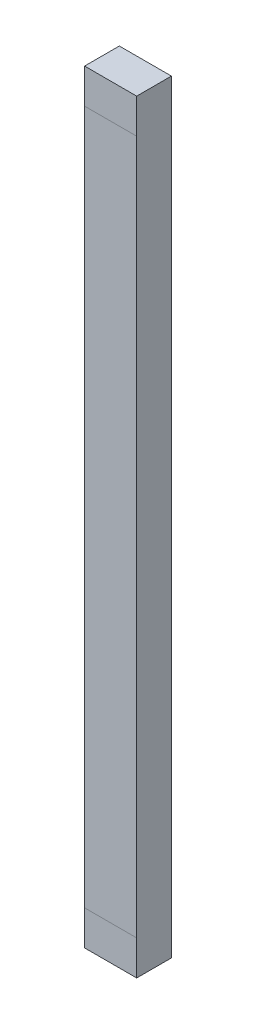
ISO-10303-21;
HEADER;
FILE_DESCRIPTION(('STEP AP214'),'2;1');
FILE_NAME('part.step','',(''),(''),'','','');
FILE_SCHEMA(('AUTOMOTIVE_DESIGN { 1 0 10303 214 1 1 1 1 }'));
ENDSEC;
DATA;
#1=APPLICATION_CONTEXT('core data for automotive mechanical design processes');
#2=APPLICATION_PROTOCOL_DEFINITION('international standard','automotive_design',2000,#1);
#3=PRODUCT_CONTEXT('',#1,'mechanical');
#4=PRODUCT('Part','Part','',(#3));
#5=PRODUCT_RELATED_PRODUCT_CATEGORY('part','',(#4));
#6=PRODUCT_DEFINITION_FORMATION('','',#4);
#7=PRODUCT_DEFINITION_CONTEXT('part definition',#1,'design');
#8=PRODUCT_DEFINITION('design','',#6,#7);
#9=PRODUCT_DEFINITION_SHAPE('','',#8);
#10=(LENGTH_UNIT() NAMED_UNIT(*) SI_UNIT(.MILLI.,.METRE.));
#11=(NAMED_UNIT(*) PLANE_ANGLE_UNIT() SI_UNIT($,.RADIAN.));
#12=(NAMED_UNIT(*) SI_UNIT($,.STERADIAN.) SOLID_ANGLE_UNIT());
#13=UNCERTAINTY_MEASURE_WITH_UNIT(LENGTH_MEASURE(1.E-05),#10,'distance_accuracy_value','');
#14=(GEOMETRIC_REPRESENTATION_CONTEXT(3) GLOBAL_UNCERTAINTY_ASSIGNED_CONTEXT((#13)) GLOBAL_UNIT_ASSIGNED_CONTEXT((#10,
#11,#12)) REPRESENTATION_CONTEXT('',''));
#15=CARTESIAN_POINT('',(0.,0.,0.));
#16=DIRECTION('',(0.,0.,1.));
#17=DIRECTION('',(1.,0.,0.));
#18=AXIS2_PLACEMENT_3D('',#15,#16,#17);
#19=CARTESIAN_POINT('',(0.,2200.,0.));
#20=DIRECTION('',(0.,0.,-1.));
#21=DIRECTION('',(-1.,0.,0.));
#22=AXIS2_PLACEMENT_3D('',#19,#20,#21);
#23=PLANE('',#22);
#24=DIRECTION('',(1.,0.,0.));
#25=VECTOR('',#24,1.);
#26=CARTESIAN_POINT('',(0.,100.,0.));
#27=LINE('',#26,#25);
#28=CARTESIAN_POINT('',(0.,100.,0.));
#29=VERTEX_POINT('',#28);
#30=CARTESIAN_POINT('',(150.,100.,0.));
#31=VERTEX_POINT('',#30);
#32=EDGE_CURVE('E12',#29,#31,#27,.T.);
#33=ORIENTED_EDGE('',*,*,#32,.F.);
#34=DIRECTION('',(0.,-1.,0.));
#35=VECTOR('',#34,1.);
#36=CARTESIAN_POINT('',(0.,2200.,0.));
#37=LINE('',#36,#35);
#38=CARTESIAN_POINT('',(0.,0.,0.));
#39=VERTEX_POINT('',#38);
#40=EDGE_CURVE('E136',#29,#39,#37,.T.);
#41=ORIENTED_EDGE('',*,*,#40,.T.);
#42=DIRECTION('',(1.,0.,0.));
#43=VECTOR('',#42,1.);
#44=CARTESIAN_POINT('',(0.,0.,0.));
#45=LINE('',#44,#43);
#46=CARTESIAN_POINT('',(150.,0.,0.));
#47=VERTEX_POINT('',#46);
#48=EDGE_CURVE('E168',#39,#47,#45,.T.);
#49=ORIENTED_EDGE('',*,*,#48,.T.);
#50=DIRECTION('',(0.,-1.,0.));
#51=VECTOR('',#50,1.);
#52=CARTESIAN_POINT('',(150.,2200.,0.));
#53=LINE('',#52,#51);
#54=EDGE_CURVE('E146',#31,#47,#53,.T.);
#55=ORIENTED_EDGE('',*,*,#54,.F.);
#56=EDGE_LOOP('',(#33,#41,#49,#55));
#57=FACE_BOUND('',#56,.T.);
#58=ADVANCED_FACE('F53',(#57),#23,.F.);
#59=CARTESIAN_POINT('',(0.,2100.,0.));
#60=VERTEX_POINT('',#59);
#61=EDGE_CURVE('E133',#60,#29,#37,.T.);
#62=ORIENTED_EDGE('',*,*,#61,.T.);
#63=ORIENTED_EDGE('',*,*,#32,.T.);
#64=CARTESIAN_POINT('',(150.,2100.,0.));
#65=VERTEX_POINT('',#64);
#66=EDGE_CURVE('E145',#65,#31,#53,.T.);
#67=ORIENTED_EDGE('',*,*,#66,.F.);
#68=DIRECTION('',(1.,0.,0.));
#69=VECTOR('',#68,1.);
#70=CARTESIAN_POINT('',(0.,2100.,0.));
#71=LINE('',#70,#69);
#72=EDGE_CURVE('E63',#60,#65,#71,.T.);
#73=ORIENTED_EDGE('',*,*,#72,.F.);
#74=EDGE_LOOP('',(#62,#63,#67,#73));
#75=FACE_BOUND('',#74,.T.);
#76=ADVANCED_FACE('F190',(#75),#23,.F.);
#77=CARTESIAN_POINT('',(0.,2200.,0.));
#78=DIRECTION('',(1.,0.,0.));
#79=DIRECTION('',(0.,0.,-1.));
#80=AXIS2_PLACEMENT_3D('',#77,#78,#79);
#81=PLANE('',#80);
#82=DIRECTION('',(0.,0.,1.));
#83=VECTOR('',#82,1.);
#84=CARTESIAN_POINT('',(0.,0.,0.));
#85=LINE('',#84,#83);
#86=CARTESIAN_POINT('',(0.,0.,-100.));
#87=VERTEX_POINT('',#86);
#88=EDGE_CURVE('E171',#87,#39,#85,.T.);
#89=ORIENTED_EDGE('',*,*,#88,.T.);
#90=ORIENTED_EDGE('',*,*,#40,.F.);
#91=ORIENTED_EDGE('',*,*,#61,.F.);
#92=CARTESIAN_POINT('',(0.,2200.,0.));
#93=VERTEX_POINT('',#92);
#94=EDGE_CURVE('E112',#93,#60,#37,.T.);
#95=ORIENTED_EDGE('',*,*,#94,.F.);
#96=DIRECTION('',(0.,0.,1.));
#97=VECTOR('',#96,1.);
#98=CARTESIAN_POINT('',(0.,2200.,0.));
#99=LINE('',#98,#97);
#100=CARTESIAN_POINT('',(0.,2200.,-100.));
#101=VERTEX_POINT('',#100);
#102=EDGE_CURVE('E119',#101,#93,#99,.T.);
#103=ORIENTED_EDGE('',*,*,#102,.F.);
#104=DIRECTION('',(0.,-1.,0.));
#105=VECTOR('',#104,1.);
#106=CARTESIAN_POINT('',(0.,2200.,-100.));
#107=LINE('',#106,#105);
#108=EDGE_CURVE('E156',#101,#87,#107,.T.);
#109=ORIENTED_EDGE('',*,*,#108,.T.);
#110=EDGE_LOOP('',(#89,#90,#91,#95,#103,#109));
#111=FACE_BOUND('',#110,.T.);
#112=ADVANCED_FACE('F55',(#111),#81,.F.);
#113=ORIENTED_EDGE('',*,*,#94,.T.);
#114=ORIENTED_EDGE('',*,*,#72,.T.);
#115=CARTESIAN_POINT('',(150.,2200.,0.));
#116=VERTEX_POINT('',#115);
#117=EDGE_CURVE('E114',#116,#65,#53,.T.);
#118=ORIENTED_EDGE('',*,*,#117,.F.);
#119=DIRECTION('',(1.,0.,0.));
#120=VECTOR('',#119,1.);
#121=CARTESIAN_POINT('',(0.,2200.,0.));
#122=LINE('',#121,#120);
#123=EDGE_CURVE('E108',#93,#116,#122,.T.);
#124=ORIENTED_EDGE('',*,*,#123,.F.);
#125=EDGE_LOOP('',(#113,#114,#118,#124));
#126=FACE_BOUND('',#125,.T.);
#127=ADVANCED_FACE('F110',(#126),#23,.F.);
#128=CARTESIAN_POINT('',(150.,2200.,0.));
#129=DIRECTION('',(-1.,0.,0.));
#130=DIRECTION('',(0.,0.,1.));
#131=AXIS2_PLACEMENT_3D('',#128,#129,#130);
#132=PLANE('',#131);
#133=DIRECTION('',(0.,0.,-1.));
#134=VECTOR('',#133,1.);
#135=CARTESIAN_POINT('',(150.,0.,0.));
#136=LINE('',#135,#134);
#137=CARTESIAN_POINT('',(150.,0.,-100.));
#138=VERTEX_POINT('',#137);
#139=EDGE_CURVE('E165',#47,#138,#136,.T.);
#140=ORIENTED_EDGE('',*,*,#139,.T.);
#141=DIRECTION('',(0.,-1.,0.));
#142=VECTOR('',#141,1.);
#143=CARTESIAN_POINT('',(150.,2200.,-100.));
#144=LINE('',#143,#142);
#145=CARTESIAN_POINT('',(150.,2200.,-100.));
#146=VERTEX_POINT('',#145);
#147=EDGE_CURVE('E153',#146,#138,#144,.T.);
#148=ORIENTED_EDGE('',*,*,#147,.F.);
#149=DIRECTION('',(0.,0.,-1.));
#150=VECTOR('',#149,1.);
#151=CARTESIAN_POINT('',(150.,2200.,0.));
#152=LINE('',#151,#150);
#153=EDGE_CURVE('E118',#116,#146,#152,.T.);
#154=ORIENTED_EDGE('',*,*,#153,.F.);
#155=ORIENTED_EDGE('',*,*,#117,.T.);
#156=ORIENTED_EDGE('',*,*,#66,.T.);
#157=ORIENTED_EDGE('',*,*,#54,.T.);
#158=EDGE_LOOP('',(#140,#148,#154,#155,#156,#157));
#159=FACE_BOUND('',#158,.T.);
#160=ADVANCED_FACE('F184',(#159),#132,.F.);
#161=CARTESIAN_POINT('',(0.,2200.,-100.));
#162=DIRECTION('',(0.,0.,1.));
#163=DIRECTION('',(1.,0.,0.));
#164=AXIS2_PLACEMENT_3D('',#161,#162,#163);
#165=PLANE('',#164);
#166=DIRECTION('',(-1.,0.,0.));
#167=VECTOR('',#166,1.);
#168=CARTESIAN_POINT('',(0.,0.,-100.));
#169=LINE('',#168,#167);
#170=EDGE_CURVE('E129',#138,#87,#169,.T.);
#171=ORIENTED_EDGE('',*,*,#170,.T.);
#172=ORIENTED_EDGE('',*,*,#108,.F.);
#173=DIRECTION('',(-1.,0.,0.));
#174=VECTOR('',#173,1.);
#175=CARTESIAN_POINT('',(0.,2200.,-100.));
#176=LINE('',#175,#174);
#177=EDGE_CURVE('E124',#146,#101,#176,.T.);
#178=ORIENTED_EDGE('',*,*,#177,.F.);
#179=ORIENTED_EDGE('',*,*,#147,.T.);
#180=EDGE_LOOP('',(#171,#172,#178,#179));
#181=FACE_BOUND('',#180,.T.);
#182=ADVANCED_FACE('F186',(#181),#165,.F.);
#183=CARTESIAN_POINT('',(0.,2200.,0.));
#184=DIRECTION('',(0.,-1.,0.));
#185=DIRECTION('',(0.,0.,-1.));
#186=AXIS2_PLACEMENT_3D('',#183,#184,#185);
#187=PLANE('',#186);
#188=ORIENTED_EDGE('',*,*,#102,.T.);
#189=ORIENTED_EDGE('',*,*,#123,.T.);
#190=ORIENTED_EDGE('',*,*,#153,.T.);
#191=ORIENTED_EDGE('',*,*,#177,.T.);
#192=EDGE_LOOP('',(#188,#189,#190,#191));
#193=FACE_BOUND('',#192,.T.);
#194=ADVANCED_FACE('F122',(#193),#187,.F.);
#195=CARTESIAN_POINT('',(0.,0.,0.));
#196=DIRECTION('',(0.,-1.,0.));
#197=DIRECTION('',(0.,0.,-1.));
#198=AXIS2_PLACEMENT_3D('',#195,#196,#197);
#199=PLANE('',#198);
#200=ORIENTED_EDGE('',*,*,#88,.F.);
#201=ORIENTED_EDGE('',*,*,#170,.F.);
#202=ORIENTED_EDGE('',*,*,#139,.F.);
#203=ORIENTED_EDGE('',*,*,#48,.F.);
#204=EDGE_LOOP('',(#200,#201,#202,#203));
#205=FACE_BOUND('',#204,.T.);
#206=ADVANCED_FACE('F189',(#205),#199,.T.);
#207=CLOSED_SHELL('',(#58,#76,#112,#127,#160,#182,#194,#206));
#208=MANIFOLD_SOLID_BREP('B2',#207);
#209=ADVANCED_BREP_SHAPE_REPRESENTATION('',(#18,#208),#14);
#210=SHAPE_DEFINITION_REPRESENTATION(#9,#209);
ENDSEC;
END-ISO-10303-21;
